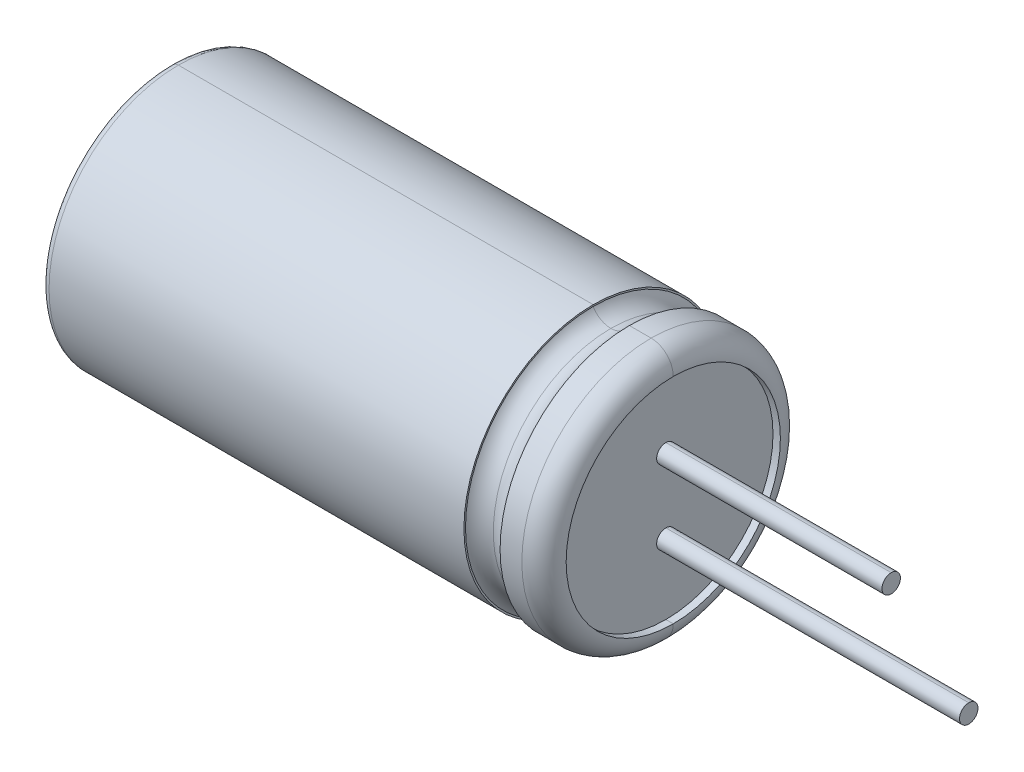
ISO-10303-21;
HEADER;
FILE_DESCRIPTION(('STEP AP214'),'2;1');
FILE_NAME('part.step','',(''),(''),'','','');
FILE_SCHEMA(('AUTOMOTIVE_DESIGN { 1 0 10303 214 1 1 1 1 }'));
ENDSEC;
DATA;
#1=APPLICATION_CONTEXT('core data for automotive mechanical design processes');
#2=APPLICATION_PROTOCOL_DEFINITION('international standard','automotive_design',2000,#1);
#3=PRODUCT_CONTEXT('',#1,'mechanical');
#4=PRODUCT('Part','Part','',(#3));
#5=PRODUCT_RELATED_PRODUCT_CATEGORY('part','',(#4));
#6=PRODUCT_DEFINITION_FORMATION('','',#4);
#7=PRODUCT_DEFINITION_CONTEXT('part definition',#1,'design');
#8=PRODUCT_DEFINITION('design','',#6,#7);
#9=PRODUCT_DEFINITION_SHAPE('','',#8);
#10=(LENGTH_UNIT() NAMED_UNIT(*) SI_UNIT(.MILLI.,.METRE.));
#11=(NAMED_UNIT(*) PLANE_ANGLE_UNIT() SI_UNIT($,.RADIAN.));
#12=(NAMED_UNIT(*) SI_UNIT($,.STERADIAN.) SOLID_ANGLE_UNIT());
#13=UNCERTAINTY_MEASURE_WITH_UNIT(LENGTH_MEASURE(1.E-05),#10,'distance_accuracy_value','');
#14=(GEOMETRIC_REPRESENTATION_CONTEXT(3) GLOBAL_UNCERTAINTY_ASSIGNED_CONTEXT((#13)) GLOBAL_UNIT_ASSIGNED_CONTEXT((#10,
#11,#12)) REPRESENTATION_CONTEXT('',''));
#15=CARTESIAN_POINT('',(0.,0.,0.));
#16=DIRECTION('',(0.,0.,1.));
#17=DIRECTION('',(1.,0.,0.));
#18=AXIS2_PLACEMENT_3D('',#15,#16,#17);
#19=CARTESIAN_POINT('',(-33.,0.,0.));
#20=DIRECTION('',(1.,0.,0.));
#21=DIRECTION('',(0.,1.,0.));
#22=AXIS2_PLACEMENT_3D('',#19,#20,#21);
#23=TOROIDAL_SURFACE('',#22,16.5,1.);
#24=CARTESIAN_POINT('',(-33.,-16.5,0.));
#25=DIRECTION('',(0.,0.,1.));
#26=DIRECTION('',(0.,-1.,0.));
#27=AXIS2_PLACEMENT_3D('',#24,#25,#26);
#28=CIRCLE('',#27,1.);
#29=CARTESIAN_POINT('',(-34.,-16.5,0.));
#30=VERTEX_POINT('',#29);
#31=CARTESIAN_POINT('',(-33.,-17.5,0.));
#32=VERTEX_POINT('',#31);
#33=EDGE_CURVE('E210',#30,#32,#28,.T.);
#34=ORIENTED_EDGE('',*,*,#33,.F.);
#35=CARTESIAN_POINT('',(-34.,0.,0.));
#36=DIRECTION('',(-1.,0.,0.));
#37=DIRECTION('',(0.,1.,0.));
#38=AXIS2_PLACEMENT_3D('',#35,#36,#37);
#39=CIRCLE('',#38,16.5);
#40=CARTESIAN_POINT('',(-34.,16.5,0.));
#41=VERTEX_POINT('',#40);
#42=EDGE_CURVE('E266',#41,#30,#39,.T.);
#43=ORIENTED_EDGE('',*,*,#42,.F.);
#44=CARTESIAN_POINT('',(-33.,16.5,0.));
#45=DIRECTION('',(0.,0.,-1.));
#46=DIRECTION('',(-1.,0.,0.));
#47=AXIS2_PLACEMENT_3D('',#44,#45,#46);
#48=CIRCLE('',#47,1.);
#49=CARTESIAN_POINT('',(-33.,17.5,0.));
#50=VERTEX_POINT('',#49);
#51=EDGE_CURVE('E209',#41,#50,#48,.T.);
#52=ORIENTED_EDGE('',*,*,#51,.T.);
#53=CARTESIAN_POINT('',(-33.,0.,0.));
#54=DIRECTION('',(1.,0.,0.));
#55=DIRECTION('',(0.,1.,0.));
#56=AXIS2_PLACEMENT_3D('',#53,#54,#55);
#57=CIRCLE('',#56,17.5);
#58=EDGE_CURVE('E260',#32,#50,#57,.T.);
#59=ORIENTED_EDGE('',*,*,#58,.F.);
#60=EDGE_LOOP('',(#34,#43,#52,#59));
#61=FACE_BOUND('',#60,.T.);
#62=ADVANCED_FACE('F15',(#61),#23,.T.);
#63=CARTESIAN_POINT('',(74.,-5.,0.));
#64=DIRECTION('',(1.,0.,0.));
#65=DIRECTION('',(0.,1.,0.));
#66=AXIS2_PLACEMENT_3D('',#63,#64,#65);
#67=PLANE('',#66);
#68=CARTESIAN_POINT('',(74.,-5.,0.));
#69=DIRECTION('',(1.,0.,0.));
#70=DIRECTION('',(0.,1.,0.));
#71=AXIS2_PLACEMENT_3D('',#68,#69,#70);
#72=CIRCLE('',#71,1.25);
#73=CARTESIAN_POINT('',(74.,-6.25,0.));
#74=VERTEX_POINT('',#73);
#75=CARTESIAN_POINT('',(74.,-3.75,0.));
#76=VERTEX_POINT('',#75);
#77=EDGE_CURVE('E10',#74,#76,#72,.T.);
#78=ORIENTED_EDGE('',*,*,#77,.T.);
#79=CARTESIAN_POINT('',(74.,-5.,0.));
#80=DIRECTION('',(1.,0.,0.));
#81=DIRECTION('',(0.,1.,0.));
#82=AXIS2_PLACEMENT_3D('',#79,#80,#81);
#83=CIRCLE('',#82,1.25);
#84=EDGE_CURVE('E228',#76,#74,#83,.T.);
#85=ORIENTED_EDGE('',*,*,#84,.T.);
#86=EDGE_LOOP('',(#78,#85));
#87=FACE_BOUND('',#86,.T.);
#88=ADVANCED_FACE('F511',(#87),#67,.T.);
#89=CARTESIAN_POINT('',(63.5,-5.,0.));
#90=DIRECTION('',(-1.,0.,0.));
#91=DIRECTION('',(0.,-1.,0.));
#92=AXIS2_PLACEMENT_3D('',#89,#90,#91);
#93=CYLINDRICAL_SURFACE('',#92,1.25);
#94=DIRECTION('',(-1.,0.,0.));
#95=VECTOR('',#94,1.);
#96=CARTESIAN_POINT('',(63.5,-3.75,0.));
#97=LINE('',#96,#95);
#98=CARTESIAN_POINT('',(33.,-3.75,0.));
#99=VERTEX_POINT('',#98);
#100=EDGE_CURVE('E225',#76,#99,#97,.T.);
#101=ORIENTED_EDGE('',*,*,#100,.F.);
#102=ORIENTED_EDGE('',*,*,#77,.F.);
#103=DIRECTION('',(-1.,0.,0.));
#104=VECTOR('',#103,1.);
#105=CARTESIAN_POINT('',(63.5,-6.25,0.));
#106=LINE('',#105,#104);
#107=CARTESIAN_POINT('',(33.,-6.25,0.));
#108=VERTEX_POINT('',#107);
#109=EDGE_CURVE('E191',#74,#108,#106,.T.);
#110=ORIENTED_EDGE('',*,*,#109,.T.);
#111=CARTESIAN_POINT('',(33.,-5.,0.));
#112=DIRECTION('',(1.,0.,0.));
#113=DIRECTION('',(0.,1.,0.));
#114=AXIS2_PLACEMENT_3D('',#111,#112,#113);
#115=CIRCLE('',#114,1.25);
#116=EDGE_CURVE('E263',#108,#99,#115,.T.);
#117=ORIENTED_EDGE('',*,*,#116,.T.);
#118=EDGE_LOOP('',(#101,#102,#110,#117));
#119=FACE_BOUND('',#118,.T.);
#120=ADVANCED_FACE('F566',(#119),#93,.T.);
#121=CARTESIAN_POINT('',(63.5,5.,0.));
#122=DIRECTION('',(1.,0.,0.));
#123=DIRECTION('',(0.,1.,0.));
#124=AXIS2_PLACEMENT_3D('',#121,#122,#123);
#125=PLANE('',#124);
#126=CARTESIAN_POINT('',(63.5,5.,0.));
#127=DIRECTION('',(1.,0.,0.));
#128=DIRECTION('',(0.,1.,0.));
#129=AXIS2_PLACEMENT_3D('',#126,#127,#128);
#130=CIRCLE('',#129,1.25);
#131=CARTESIAN_POINT('',(63.5,3.75,0.));
#132=VERTEX_POINT('',#131);
#133=CARTESIAN_POINT('',(63.5,6.25,0.));
#134=VERTEX_POINT('',#133);
#135=EDGE_CURVE('E26',#132,#134,#130,.T.);
#136=ORIENTED_EDGE('',*,*,#135,.T.);
#137=CARTESIAN_POINT('',(63.5,5.,0.));
#138=DIRECTION('',(1.,0.,0.));
#139=DIRECTION('',(0.,1.,0.));
#140=AXIS2_PLACEMENT_3D('',#137,#138,#139);
#141=CIRCLE('',#140,1.25);
#142=EDGE_CURVE('E195',#134,#132,#141,.T.);
#143=ORIENTED_EDGE('',*,*,#142,.T.);
#144=EDGE_LOOP('',(#136,#143));
#145=FACE_BOUND('',#144,.T.);
#146=ADVANCED_FACE('F570',(#145),#125,.T.);
#147=CARTESIAN_POINT('',(63.5,5.,0.));
#148=DIRECTION('',(-1.,0.,0.));
#149=DIRECTION('',(0.,-1.,0.));
#150=AXIS2_PLACEMENT_3D('',#147,#148,#149);
#151=CYLINDRICAL_SURFACE('',#150,1.25);
#152=DIRECTION('',(-1.,0.,0.));
#153=VECTOR('',#152,1.);
#154=CARTESIAN_POINT('',(63.5,6.25,0.));
#155=LINE('',#154,#153);
#156=CARTESIAN_POINT('',(33.,6.25,0.));
#157=VERTEX_POINT('',#156);
#158=EDGE_CURVE('E223',#134,#157,#155,.T.);
#159=ORIENTED_EDGE('',*,*,#158,.F.);
#160=ORIENTED_EDGE('',*,*,#135,.F.);
#161=DIRECTION('',(-1.,0.,0.));
#162=VECTOR('',#161,1.);
#163=CARTESIAN_POINT('',(63.5,3.75,0.));
#164=LINE('',#163,#162);
#165=CARTESIAN_POINT('',(33.,3.75,0.));
#166=VERTEX_POINT('',#165);
#167=EDGE_CURVE('E272',#132,#166,#164,.T.);
#168=ORIENTED_EDGE('',*,*,#167,.T.);
#169=CARTESIAN_POINT('',(33.,5.,0.));
#170=DIRECTION('',(1.,0.,0.));
#171=DIRECTION('',(0.,1.,0.));
#172=AXIS2_PLACEMENT_3D('',#169,#170,#171);
#173=CIRCLE('',#172,1.25);
#174=EDGE_CURVE('E63',#166,#157,#173,.T.);
#175=ORIENTED_EDGE('',*,*,#174,.T.);
#176=EDGE_LOOP('',(#159,#160,#168,#175));
#177=FACE_BOUND('',#176,.T.);
#178=ADVANCED_FACE('F621',(#177),#151,.T.);
#179=CARTESIAN_POINT('',(33.,0.,0.));
#180=DIRECTION('',(1.,0.,0.));
#181=DIRECTION('',(0.,1.,0.));
#182=AXIS2_PLACEMENT_3D('',#179,#180,#181);
#183=PLANE('',#182);
#184=ORIENTED_EDGE('',*,*,#174,.F.);
#185=CARTESIAN_POINT('',(33.,5.,0.));
#186=DIRECTION('',(1.,0.,0.));
#187=DIRECTION('',(0.,1.,0.));
#188=AXIS2_PLACEMENT_3D('',#185,#186,#187);
#189=CIRCLE('',#188,1.25);
#190=EDGE_CURVE('E268',#157,#166,#189,.T.);
#191=ORIENTED_EDGE('',*,*,#190,.F.);
#192=EDGE_LOOP('',(#184,#191));
#193=FACE_BOUND('',#192,.T.);
#194=ORIENTED_EDGE('',*,*,#116,.F.);
#195=CARTESIAN_POINT('',(33.,-5.,0.));
#196=DIRECTION('',(1.,0.,0.));
#197=DIRECTION('',(0.,1.,0.));
#198=AXIS2_PLACEMENT_3D('',#195,#196,#197);
#199=CIRCLE('',#198,1.25);
#200=EDGE_CURVE('E196',#99,#108,#199,.T.);
#201=ORIENTED_EDGE('',*,*,#200,.F.);
#202=EDGE_LOOP('',(#194,#201));
#203=FACE_BOUND('',#202,.T.);
#204=CARTESIAN_POINT('',(33.,0.,0.));
#205=DIRECTION('',(1.,0.,0.));
#206=DIRECTION('',(0.,1.,0.));
#207=AXIS2_PLACEMENT_3D('',#204,#205,#206);
#208=CIRCLE('',#207,14.5);
#209=CARTESIAN_POINT('',(33.,14.5,0.));
#210=VERTEX_POINT('',#209);
#211=CARTESIAN_POINT('',(33.,-14.5,0.));
#212=VERTEX_POINT('',#211);
#213=EDGE_CURVE('E259',#210,#212,#208,.T.);
#214=ORIENTED_EDGE('',*,*,#213,.T.);
#215=CARTESIAN_POINT('',(33.,0.,0.));
#216=DIRECTION('',(1.,0.,0.));
#217=DIRECTION('',(0.,1.,0.));
#218=AXIS2_PLACEMENT_3D('',#215,#216,#217);
#219=CIRCLE('',#218,14.5);
#220=EDGE_CURVE('E216',#212,#210,#219,.T.);
#221=ORIENTED_EDGE('',*,*,#220,.T.);
#222=EDGE_LOOP('',(#214,#221));
#223=FACE_BOUND('',#222,.T.);
#224=ADVANCED_FACE('F581',(#193,#203,#223),#183,.T.);
#225=CARTESIAN_POINT('',(33.,0.,0.));
#226=DIRECTION('',(1.,0.,0.));
#227=DIRECTION('',(0.,1.,0.));
#228=AXIS2_PLACEMENT_3D('',#225,#226,#227);
#229=CYLINDRICAL_SURFACE('',#228,14.5);
#230=DIRECTION('',(1.,0.,0.));
#231=VECTOR('',#230,1.);
#232=CARTESIAN_POINT('',(33.,-14.5,0.));
#233=LINE('',#232,#231);
#234=CARTESIAN_POINT('',(34.,-14.5,0.));
#235=VERTEX_POINT('',#234);
#236=EDGE_CURVE('E211',#212,#235,#233,.T.);
#237=ORIENTED_EDGE('',*,*,#236,.F.);
#238=ORIENTED_EDGE('',*,*,#213,.F.);
#239=DIRECTION('',(1.,0.,0.));
#240=VECTOR('',#239,1.);
#241=CARTESIAN_POINT('',(33.,14.5,0.));
#242=LINE('',#241,#240);
#243=CARTESIAN_POINT('',(34.,14.5,0.));
#244=VERTEX_POINT('',#243);
#245=EDGE_CURVE('E310',#210,#244,#242,.T.);
#246=ORIENTED_EDGE('',*,*,#245,.T.);
#247=CARTESIAN_POINT('',(34.,0.,0.));
#248=DIRECTION('',(1.,0.,0.));
#249=DIRECTION('',(0.,1.,0.));
#250=AXIS2_PLACEMENT_3D('',#247,#248,#249);
#251=CIRCLE('',#250,14.5);
#252=EDGE_CURVE('E189',#244,#235,#251,.T.);
#253=ORIENTED_EDGE('',*,*,#252,.T.);
#254=EDGE_LOOP('',(#237,#238,#246,#253));
#255=FACE_BOUND('',#254,.T.);
#256=ADVANCED_FACE('F576',(#255),#229,.F.);
#257=CARTESIAN_POINT('',(31.,0.,0.));
#258=DIRECTION('',(-1.,0.,0.));
#259=DIRECTION('',(0.,-1.,0.));
#260=AXIS2_PLACEMENT_3D('',#257,#258,#259);
#261=TOROIDAL_SURFACE('',#260,14.5,3.);
#262=CARTESIAN_POINT('',(31.,14.5,0.));
#263=DIRECTION('',(0.,0.,1.));
#264=DIRECTION('',(0.,-1.,0.));
#265=AXIS2_PLACEMENT_3D('',#262,#263,#264);
#266=CIRCLE('',#265,3.);
#267=CARTESIAN_POINT('',(31.,17.5,0.));
#268=VERTEX_POINT('',#267);
#269=EDGE_CURVE('E297',#244,#268,#266,.T.);
#270=ORIENTED_EDGE('',*,*,#269,.F.);
#271=CARTESIAN_POINT('',(34.,0.,0.));
#272=DIRECTION('',(1.,0.,0.));
#273=DIRECTION('',(0.,1.,0.));
#274=AXIS2_PLACEMENT_3D('',#271,#272,#273);
#275=CIRCLE('',#274,14.5);
#276=EDGE_CURVE('E215',#235,#244,#275,.T.);
#277=ORIENTED_EDGE('',*,*,#276,.F.);
#278=CARTESIAN_POINT('',(31.,-14.5,0.));
#279=DIRECTION('',(0.,0.,-1.));
#280=DIRECTION('',(-1.,0.,0.));
#281=AXIS2_PLACEMENT_3D('',#278,#279,#280);
#282=CIRCLE('',#281,3.);
#283=CARTESIAN_POINT('',(31.,-17.5,0.));
#284=VERTEX_POINT('',#283);
#285=EDGE_CURVE('E200',#235,#284,#282,.T.);
#286=ORIENTED_EDGE('',*,*,#285,.T.);
#287=CARTESIAN_POINT('',(31.,0.,0.));
#288=DIRECTION('',(-1.,0.,0.));
#289=DIRECTION('',(0.,-1.,0.));
#290=AXIS2_PLACEMENT_3D('',#287,#288,#289);
#291=CIRCLE('',#290,17.5);
#292=EDGE_CURVE('E255',#268,#284,#291,.T.);
#293=ORIENTED_EDGE('',*,*,#292,.F.);
#294=EDGE_LOOP('',(#270,#277,#286,#293));
#295=FACE_BOUND('',#294,.T.);
#296=ADVANCED_FACE('F580',(#295),#261,.T.);
#297=CARTESIAN_POINT('',(-34.,0.,0.));
#298=DIRECTION('',(-1.,0.,0.));
#299=DIRECTION('',(0.,-1.,0.));
#300=AXIS2_PLACEMENT_3D('',#297,#298,#299);
#301=CYLINDRICAL_SURFACE('',#300,17.5);
#302=DIRECTION('',(-1.,0.,0.));
#303=VECTOR('',#302,1.);
#304=CARTESIAN_POINT('',(-34.,17.5,0.));
#305=LINE('',#304,#303);
#306=CARTESIAN_POINT('',(28.0539607298744,17.5,0.));
#307=VERTEX_POINT('',#306);
#308=EDGE_CURVE('E197',#268,#307,#305,.T.);
#309=ORIENTED_EDGE('',*,*,#308,.F.);
#310=ORIENTED_EDGE('',*,*,#292,.T.);
#311=DIRECTION('',(-1.,0.,0.));
#312=VECTOR('',#311,1.);
#313=CARTESIAN_POINT('',(-34.,-17.5,0.));
#314=LINE('',#313,#312);
#315=CARTESIAN_POINT('',(28.0539607298744,-17.5,0.));
#316=VERTEX_POINT('',#315);
#317=EDGE_CURVE('E158',#284,#316,#314,.T.);
#318=ORIENTED_EDGE('',*,*,#317,.T.);
#319=CARTESIAN_POINT('',(28.0539607298744,0.,0.));
#320=DIRECTION('',(-1.,0.,0.));
#321=DIRECTION('',(0.,-1.,0.));
#322=AXIS2_PLACEMENT_3D('',#319,#320,#321);
#323=CIRCLE('',#322,17.5);
#324=EDGE_CURVE('E157',#307,#316,#323,.T.);
#325=ORIENTED_EDGE('',*,*,#324,.F.);
#326=EDGE_LOOP('',(#309,#310,#318,#325));
#327=FACE_BOUND('',#326,.T.);
#328=ADVANCED_FACE('F289',(#327),#301,.T.);
#329=CARTESIAN_POINT('',(25.550593522731,0.,0.));
#330=DIRECTION('',(-1.,0.,0.));
#331=DIRECTION('',(0.,-1.,0.));
#332=AXIS2_PLACEMENT_3D('',#329,#330,#331);
#333=TOROIDAL_SURFACE('',#332,18.6785505202947,2.76691682250975);
#334=CARTESIAN_POINT('',(25.550593522731,0.,0.));
#335=DIRECTION('',(-1.,0.,0.));
#336=DIRECTION('',(0.,-1.,0.));
#337=AXIS2_PLACEMENT_3D('',#334,#335,#336);
#338=CIRCLE('',#337,15.9116336977849);
#339=CARTESIAN_POINT('',(25.550593522731,-15.9116336977849,0.));
#340=VERTEX_POINT('',#339);
#341=CARTESIAN_POINT('',(25.550593522731,15.9116336977849,0.));
#342=VERTEX_POINT('',#341);
#343=EDGE_CURVE('E149',#340,#342,#338,.T.);
#344=ORIENTED_EDGE('',*,*,#343,.F.);
#345=CARTESIAN_POINT('',(25.550593522731,-18.6785505202947,0.));
#346=DIRECTION('',(0.,0.,-1.));
#347=DIRECTION('',(-1.,0.,0.));
#348=AXIS2_PLACEMENT_3D('',#345,#346,#347);
#349=CIRCLE('',#348,2.76691682250975);
#350=EDGE_CURVE('E163',#340,#316,#349,.T.);
#351=ORIENTED_EDGE('',*,*,#350,.T.);
#352=CARTESIAN_POINT('',(28.0539607298744,0.,0.));
#353=DIRECTION('',(-1.,0.,0.));
#354=DIRECTION('',(0.,-1.,0.));
#355=AXIS2_PLACEMENT_3D('',#352,#353,#354);
#356=CIRCLE('',#355,17.5);
#357=EDGE_CURVE('E152',#316,#307,#356,.T.);
#358=ORIENTED_EDGE('',*,*,#357,.T.);
#359=CARTESIAN_POINT('',(25.550593522731,18.6785505202947,0.));
#360=DIRECTION('',(0.,0.,1.));
#361=DIRECTION('',(0.,-1.,0.));
#362=AXIS2_PLACEMENT_3D('',#359,#360,#361);
#363=CIRCLE('',#362,2.76691682250975);
#364=EDGE_CURVE('E145',#342,#307,#363,.T.);
#365=ORIENTED_EDGE('',*,*,#364,.F.);
#366=EDGE_LOOP('',(#344,#351,#358,#365));
#367=FACE_BOUND('',#366,.T.);
#368=ADVANCED_FACE('F147',(#367),#333,.F.);
#369=CARTESIAN_POINT('',(23.159420289855,17.5,0.));
#370=DIRECTION('',(-1.,0.,0.));
#371=DIRECTION('',(0.,1.,0.));
#372=AXIS2_PLACEMENT_3D('',#369,#370,#371);
#373=PLANE('',#372);
#374=CARTESIAN_POINT('',(23.159420289855,0.,0.));
#375=DIRECTION('',(-1.,0.,0.));
#376=DIRECTION('',(0.,-1.,0.));
#377=AXIS2_PLACEMENT_3D('',#374,#375,#376);
#378=CIRCLE('',#377,17.2863869979077);
#379=CARTESIAN_POINT('',(23.1594202898551,-17.2863869979076,0.));
#380=VERTEX_POINT('',#379);
#381=CARTESIAN_POINT('',(23.159420289855,17.2863869979077,0.));
#382=VERTEX_POINT('',#381);
#383=EDGE_CURVE('E168',#380,#382,#378,.T.);
#384=ORIENTED_EDGE('',*,*,#383,.T.);
#385=CARTESIAN_POINT('',(23.159420289855,0.,0.));
#386=DIRECTION('',(-1.,0.,0.));
#387=DIRECTION('',(0.,-1.,0.));
#388=AXIS2_PLACEMENT_3D('',#385,#386,#387);
#389=CIRCLE('',#388,17.2863869979077);
#390=EDGE_CURVE('E167',#382,#380,#389,.T.);
#391=ORIENTED_EDGE('',*,*,#390,.T.);
#392=EDGE_LOOP('',(#384,#391));
#393=FACE_BOUND('',#392,.T.);
#394=CARTESIAN_POINT('',(23.159420289855,0.,0.));
#395=DIRECTION('',(-1.,0.,0.));
#396=DIRECTION('',(0.,-1.,0.));
#397=AXIS2_PLACEMENT_3D('',#394,#395,#396);
#398=CIRCLE('',#397,17.5);
#399=CARTESIAN_POINT('',(23.1594202898551,-17.5,0.));
#400=VERTEX_POINT('',#399);
#401=CARTESIAN_POINT('',(23.159420289855,17.5,0.));
#402=VERTEX_POINT('',#401);
#403=EDGE_CURVE('E254',#400,#402,#398,.T.);
#404=ORIENTED_EDGE('',*,*,#403,.F.);
#405=CARTESIAN_POINT('',(23.159420289855,0.,0.));
#406=DIRECTION('',(-1.,0.,0.));
#407=DIRECTION('',(0.,-1.,0.));
#408=AXIS2_PLACEMENT_3D('',#405,#406,#407);
#409=CIRCLE('',#408,17.5);
#410=EDGE_CURVE('E40',#402,#400,#409,.T.);
#411=ORIENTED_EDGE('',*,*,#410,.F.);
#412=EDGE_LOOP('',(#404,#411));
#413=FACE_BOUND('',#412,.T.);
#414=ADVANCED_FACE('F527',(#393,#413),#373,.F.);
#415=CARTESIAN_POINT('',(-34.,0.,0.));
#416=DIRECTION('',(-1.,0.,0.));
#417=DIRECTION('',(0.,-1.,0.));
#418=AXIS2_PLACEMENT_3D('',#415,#416,#417);
#419=CYLINDRICAL_SURFACE('',#418,17.5);
#420=DIRECTION('',(-1.,0.,0.));
#421=VECTOR('',#420,1.);
#422=CARTESIAN_POINT('',(-34.,17.5,0.));
#423=LINE('',#422,#421);
#424=EDGE_CURVE('E249',#402,#50,#423,.T.);
#425=ORIENTED_EDGE('',*,*,#424,.F.);
#426=ORIENTED_EDGE('',*,*,#410,.T.);
#427=DIRECTION('',(-1.,0.,0.));
#428=VECTOR('',#427,1.);
#429=CARTESIAN_POINT('',(-34.,-17.5,0.));
#430=LINE('',#429,#428);
#431=EDGE_CURVE('E253',#400,#32,#430,.T.);
#432=ORIENTED_EDGE('',*,*,#431,.T.);
#433=ORIENTED_EDGE('',*,*,#58,.T.);
#434=EDGE_LOOP('',(#425,#426,#432,#433));
#435=FACE_BOUND('',#434,.T.);
#436=ADVANCED_FACE('F535',(#435),#419,.T.);
#437=CARTESIAN_POINT('',(-34.,0.,0.));
#438=DIRECTION('',(1.,0.,0.));
#439=DIRECTION('',(0.,1.,0.));
#440=AXIS2_PLACEMENT_3D('',#437,#438,#439);
#441=PLANE('',#440);
#442=ORIENTED_EDGE('',*,*,#42,.T.);
#443=CARTESIAN_POINT('',(-34.,0.,0.));
#444=DIRECTION('',(-1.,0.,0.));
#445=DIRECTION('',(0.,1.,0.));
#446=AXIS2_PLACEMENT_3D('',#443,#444,#445);
#447=CIRCLE('',#446,16.5);
#448=EDGE_CURVE('E19',#30,#41,#447,.T.);
#449=ORIENTED_EDGE('',*,*,#448,.T.);
#450=EDGE_LOOP('',(#442,#449));
#451=FACE_BOUND('',#450,.T.);
#452=ADVANCED_FACE('F495',(#451),#441,.F.);
#453=CARTESIAN_POINT('',(-34.,0.,0.));
#454=DIRECTION('',(-1.,0.,0.));
#455=DIRECTION('',(0.,-1.,0.));
#456=AXIS2_PLACEMENT_3D('',#453,#454,#455);
#457=CYLINDRICAL_SURFACE('',#456,17.5);
#458=ORIENTED_EDGE('',*,*,#403,.T.);
#459=ORIENTED_EDGE('',*,*,#424,.T.);
#460=CARTESIAN_POINT('',(-33.,0.,0.));
#461=DIRECTION('',(1.,0.,0.));
#462=DIRECTION('',(0.,1.,0.));
#463=AXIS2_PLACEMENT_3D('',#460,#461,#462);
#464=CIRCLE('',#463,17.5);
#465=EDGE_CURVE('E205',#50,#32,#464,.T.);
#466=ORIENTED_EDGE('',*,*,#465,.T.);
#467=ORIENTED_EDGE('',*,*,#431,.F.);
#468=EDGE_LOOP('',(#458,#459,#466,#467));
#469=FACE_BOUND('',#468,.T.);
#470=ADVANCED_FACE('F478',(#469),#457,.T.);
#471=CARTESIAN_POINT('',(25.550593522731,0.,0.));
#472=DIRECTION('',(-1.,0.,0.));
#473=DIRECTION('',(0.,-1.,0.));
#474=AXIS2_PLACEMENT_3D('',#471,#472,#473);
#475=TOROIDAL_SURFACE('',#474,18.6785505202947,2.76691682250975);
#476=CARTESIAN_POINT('',(25.550593522731,0.,0.));
#477=DIRECTION('',(-1.,0.,0.));
#478=DIRECTION('',(0.,-1.,0.));
#479=AXIS2_PLACEMENT_3D('',#476,#477,#478);
#480=CIRCLE('',#479,15.9116336977849);
#481=EDGE_CURVE('E161',#342,#340,#480,.T.);
#482=ORIENTED_EDGE('',*,*,#481,.F.);
#483=ORIENTED_EDGE('',*,*,#364,.T.);
#484=ORIENTED_EDGE('',*,*,#324,.T.);
#485=ORIENTED_EDGE('',*,*,#350,.F.);
#486=EDGE_LOOP('',(#482,#483,#484,#485));
#487=FACE_BOUND('',#486,.T.);
#488=ADVANCED_FACE('F17',(#487),#475,.F.);
#489=CARTESIAN_POINT('',(-34.,0.,0.));
#490=DIRECTION('',(-1.,0.,0.));
#491=DIRECTION('',(0.,-1.,0.));
#492=AXIS2_PLACEMENT_3D('',#489,#490,#491);
#493=CYLINDRICAL_SURFACE('',#492,17.5);
#494=CARTESIAN_POINT('',(31.,0.,0.));
#495=DIRECTION('',(-1.,0.,0.));
#496=DIRECTION('',(0.,-1.,0.));
#497=AXIS2_PLACEMENT_3D('',#494,#495,#496);
#498=CIRCLE('',#497,17.5);
#499=EDGE_CURVE('E204',#284,#268,#498,.T.);
#500=ORIENTED_EDGE('',*,*,#499,.T.);
#501=ORIENTED_EDGE('',*,*,#308,.T.);
#502=ORIENTED_EDGE('',*,*,#357,.F.);
#503=ORIENTED_EDGE('',*,*,#317,.F.);
#504=EDGE_LOOP('',(#500,#501,#502,#503));
#505=FACE_BOUND('',#504,.T.);
#506=ADVANCED_FACE('F292',(#505),#493,.T.);
#507=CARTESIAN_POINT('',(31.,0.,0.));
#508=DIRECTION('',(-1.,0.,0.));
#509=DIRECTION('',(0.,-1.,0.));
#510=AXIS2_PLACEMENT_3D('',#507,#508,#509);
#511=TOROIDAL_SURFACE('',#510,14.5,3.);
#512=ORIENTED_EDGE('',*,*,#252,.F.);
#513=ORIENTED_EDGE('',*,*,#269,.T.);
#514=ORIENTED_EDGE('',*,*,#499,.F.);
#515=ORIENTED_EDGE('',*,*,#285,.F.);
#516=EDGE_LOOP('',(#512,#513,#514,#515));
#517=FACE_BOUND('',#516,.T.);
#518=ADVANCED_FACE('F300',(#517),#511,.T.);
#519=CARTESIAN_POINT('',(33.,0.,0.));
#520=DIRECTION('',(1.,0.,0.));
#521=DIRECTION('',(0.,1.,0.));
#522=AXIS2_PLACEMENT_3D('',#519,#520,#521);
#523=CYLINDRICAL_SURFACE('',#522,14.5);
#524=ORIENTED_EDGE('',*,*,#220,.F.);
#525=ORIENTED_EDGE('',*,*,#236,.T.);
#526=ORIENTED_EDGE('',*,*,#276,.T.);
#527=ORIENTED_EDGE('',*,*,#245,.F.);
#528=EDGE_LOOP('',(#524,#525,#526,#527));
#529=FACE_BOUND('',#528,.T.);
#530=ADVANCED_FACE('F545',(#529),#523,.F.);
#531=CARTESIAN_POINT('',(63.5,5.,0.));
#532=DIRECTION('',(-1.,0.,0.));
#533=DIRECTION('',(0.,-1.,0.));
#534=AXIS2_PLACEMENT_3D('',#531,#532,#533);
#535=CYLINDRICAL_SURFACE('',#534,1.25);
#536=ORIENTED_EDGE('',*,*,#142,.F.);
#537=ORIENTED_EDGE('',*,*,#158,.T.);
#538=ORIENTED_EDGE('',*,*,#190,.T.);
#539=ORIENTED_EDGE('',*,*,#167,.F.);
#540=EDGE_LOOP('',(#536,#537,#538,#539));
#541=FACE_BOUND('',#540,.T.);
#542=ADVANCED_FACE('F541',(#541),#535,.T.);
#543=CARTESIAN_POINT('',(63.5,-5.,0.));
#544=DIRECTION('',(-1.,0.,0.));
#545=DIRECTION('',(0.,-1.,0.));
#546=AXIS2_PLACEMENT_3D('',#543,#544,#545);
#547=CYLINDRICAL_SURFACE('',#546,1.25);
#548=ORIENTED_EDGE('',*,*,#84,.F.);
#549=ORIENTED_EDGE('',*,*,#100,.T.);
#550=ORIENTED_EDGE('',*,*,#200,.T.);
#551=ORIENTED_EDGE('',*,*,#109,.F.);
#552=EDGE_LOOP('',(#548,#549,#550,#551));
#553=FACE_BOUND('',#552,.T.);
#554=ADVANCED_FACE('F487',(#553),#547,.T.);
#555=CARTESIAN_POINT('',(-33.,0.,0.));
#556=DIRECTION('',(1.,0.,0.));
#557=DIRECTION('',(0.,1.,0.));
#558=AXIS2_PLACEMENT_3D('',#555,#556,#557);
#559=TOROIDAL_SURFACE('',#558,16.5,1.);
#560=ORIENTED_EDGE('',*,*,#448,.F.);
#561=ORIENTED_EDGE('',*,*,#33,.T.);
#562=ORIENTED_EDGE('',*,*,#465,.F.);
#563=ORIENTED_EDGE('',*,*,#51,.F.);
#564=EDGE_LOOP('',(#560,#561,#562,#563));
#565=FACE_BOUND('',#564,.T.);
#566=ADVANCED_FACE('F483',(#565),#559,.T.);
#567=CARTESIAN_POINT('',(25.550593522731,0.,0.));
#568=DIRECTION('',(-1.,0.,0.));
#569=DIRECTION('',(0.,-1.,0.));
#570=AXIS2_PLACEMENT_3D('',#567,#568,#569);
#571=TOROIDAL_SURFACE('',#570,18.6785505202947,2.76691682250975);
#572=CARTESIAN_POINT('',(25.550593522731,18.6785505202947,0.));
#573=DIRECTION('',(0.,0.,1.));
#574=DIRECTION('',(0.,-1.,0.));
#575=AXIS2_PLACEMENT_3D('',#572,#573,#574);
#576=CIRCLE('',#575,2.76691682250975);
#577=EDGE_CURVE('E171',#382,#342,#576,.T.);
#578=ORIENTED_EDGE('',*,*,#577,.T.);
#579=ORIENTED_EDGE('',*,*,#481,.T.);
#580=CARTESIAN_POINT('',(25.550593522731,-18.6785505202947,0.));
#581=DIRECTION('',(0.,0.,-1.));
#582=DIRECTION('',(-1.,0.,0.));
#583=AXIS2_PLACEMENT_3D('',#580,#581,#582);
#584=CIRCLE('',#583,2.76691682250975);
#585=EDGE_CURVE('E179',#380,#340,#584,.T.);
#586=ORIENTED_EDGE('',*,*,#585,.F.);
#587=ORIENTED_EDGE('',*,*,#390,.F.);
#588=EDGE_LOOP('',(#578,#579,#586,#587));
#589=FACE_BOUND('',#588,.T.);
#590=ADVANCED_FACE('F172',(#589),#571,.F.);
#591=CARTESIAN_POINT('',(25.550593522731,0.,0.));
#592=DIRECTION('',(-1.,0.,0.));
#593=DIRECTION('',(0.,-1.,0.));
#594=AXIS2_PLACEMENT_3D('',#591,#592,#593);
#595=TOROIDAL_SURFACE('',#594,18.6785505202947,2.76691682250975);
#596=ORIENTED_EDGE('',*,*,#585,.T.);
#597=ORIENTED_EDGE('',*,*,#343,.T.);
#598=ORIENTED_EDGE('',*,*,#577,.F.);
#599=ORIENTED_EDGE('',*,*,#383,.F.);
#600=EDGE_LOOP('',(#596,#597,#598,#599));
#601=FACE_BOUND('',#600,.T.);
#602=ADVANCED_FACE('F178',(#601),#595,.F.);
#603=CLOSED_SHELL('',(#62,#88,#120,#146,#178,#224,#256,#296,#328,#368,#414,#436,#452,#470,#488,
#506,#518,#530,#542,#554,#566,#590,#602));
#604=MANIFOLD_SOLID_BREP('B1',#603);
#605=ADVANCED_BREP_SHAPE_REPRESENTATION('',(#18,#604),#14);
#606=SHAPE_DEFINITION_REPRESENTATION(#9,#605);
ENDSEC;
END-ISO-10303-21;
